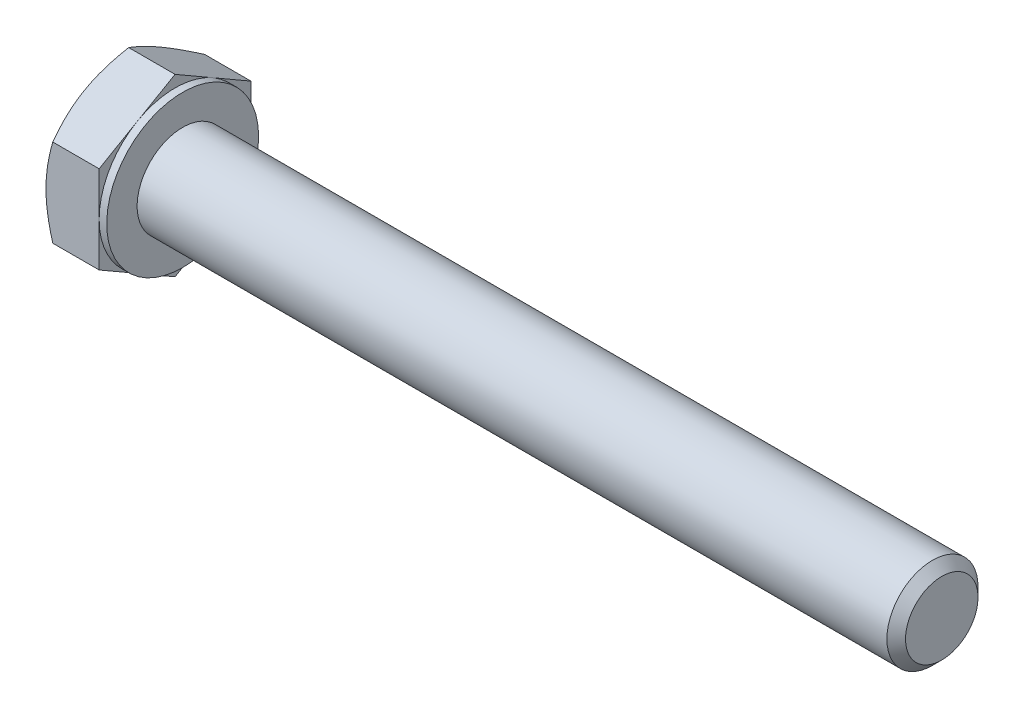
ISO-10303-21;
HEADER;
FILE_DESCRIPTION(('STEP AP214'),'2;1');
FILE_NAME('part.step','',(''),(''),'','','');
FILE_SCHEMA(('AUTOMOTIVE_DESIGN { 1 0 10303 214 1 1 1 1 }'));
ENDSEC;
DATA;
#1=APPLICATION_CONTEXT('core data for automotive mechanical design processes');
#2=APPLICATION_PROTOCOL_DEFINITION('international standard','automotive_design',2000,#1);
#3=PRODUCT_CONTEXT('',#1,'mechanical');
#4=PRODUCT('Part','Part','',(#3));
#5=PRODUCT_RELATED_PRODUCT_CATEGORY('part','',(#4));
#6=PRODUCT_DEFINITION_FORMATION('','',#4);
#7=PRODUCT_DEFINITION_CONTEXT('part definition',#1,'design');
#8=PRODUCT_DEFINITION('design','',#6,#7);
#9=PRODUCT_DEFINITION_SHAPE('','',#8);
#10=(LENGTH_UNIT() NAMED_UNIT(*) SI_UNIT(.MILLI.,.METRE.));
#11=(NAMED_UNIT(*) PLANE_ANGLE_UNIT() SI_UNIT($,.RADIAN.));
#12=(NAMED_UNIT(*) SI_UNIT($,.STERADIAN.) SOLID_ANGLE_UNIT());
#13=UNCERTAINTY_MEASURE_WITH_UNIT(LENGTH_MEASURE(1.E-05),#10,'distance_accuracy_value','');
#14=(GEOMETRIC_REPRESENTATION_CONTEXT(3) GLOBAL_UNCERTAINTY_ASSIGNED_CONTEXT((#13)) GLOBAL_UNIT_ASSIGNED_CONTEXT((#10,
#11,#12)) REPRESENTATION_CONTEXT('',''));
#15=CARTESIAN_POINT('',(0.,0.,0.));
#16=DIRECTION('',(0.,0.,1.));
#17=DIRECTION('',(1.,0.,0.));
#18=AXIS2_PLACEMENT_3D('',#15,#16,#17);
#19=CARTESIAN_POINT('',(0.,4.,0.));
#20=DIRECTION('',(1.,0.,0.));
#21=DIRECTION('',(0.,1.,0.));
#22=AXIS2_PLACEMENT_3D('',#19,#20,#21);
#23=PLANE('',#22);
#24=CARTESIAN_POINT('',(0.,0.,0.));
#25=DIRECTION('',(1.,0.,0.));
#26=DIRECTION('',(0.,1.,0.));
#27=AXIS2_PLACEMENT_3D('',#24,#25,#26);
#28=CIRCLE('',#27,3.);
#29=CARTESIAN_POINT('',(0.,-3.,0.));
#30=VERTEX_POINT('',#29);
#31=EDGE_CURVE('E68',#30,#30,#28,.T.);
#32=ORIENTED_EDGE('',*,*,#31,.F.);
#33=EDGE_LOOP('',(#32));
#34=FACE_BOUND('',#33,.T.);
#35=CARTESIAN_POINT('',(0.,0.,0.));
#36=DIRECTION('',(1.,0.,0.));
#37=DIRECTION('',(0.,1.,0.));
#38=AXIS2_PLACEMENT_3D('',#35,#36,#37);
#39=CIRCLE('',#38,5.);
#40=CARTESIAN_POINT('',(0.,-5.,0.));
#41=VERTEX_POINT('',#40);
#42=EDGE_CURVE('E27',#41,#41,#39,.T.);
#43=ORIENTED_EDGE('',*,*,#42,.T.);
#44=EDGE_LOOP('',(#43));
#45=FACE_BOUND('',#44,.T.);
#46=ADVANCED_FACE('F17',(#34,#45),#23,.T.);
#47=CARTESIAN_POINT('',(-0.250049999999993,0.,0.));
#48=DIRECTION('',(1.,0.,0.));
#49=DIRECTION('',(0.,1.,0.));
#50=AXIS2_PLACEMENT_3D('',#47,#48,#49);
#51=CYLINDRICAL_SURFACE('',#50,5.);
#52=ORIENTED_EDGE('',*,*,#42,.F.);
#53=DIRECTION('',(-1.,0.,0.));
#54=VECTOR('',#53,1.);
#55=CARTESIAN_POINT('',(-0.250049999999993,-5.,0.));
#56=LINE('',#55,#54);
#57=CARTESIAN_POINT('',(-0.5001,-5.,0.));
#58=VERTEX_POINT('',#57);
#59=EDGE_CURVE('E11',#41,#58,#56,.T.);
#60=ORIENTED_EDGE('',*,*,#59,.T.);
#61=CARTESIAN_POINT('',(-0.500099999999994,0.,0.));
#62=DIRECTION('',(1.,0.,0.));
#63=DIRECTION('',(0.,1.,0.));
#64=AXIS2_PLACEMENT_3D('',#61,#62,#63);
#65=CIRCLE('',#64,5.);
#66=CARTESIAN_POINT('',(-0.500099999999994,-4.33012701892219,-2.5));
#67=VERTEX_POINT('',#66);
#68=EDGE_CURVE('E368',#58,#67,#65,.T.);
#69=ORIENTED_EDGE('',*,*,#68,.T.);
#70=CARTESIAN_POINT('',(-0.500099999999994,0.,0.));
#71=DIRECTION('',(1.,0.,0.));
#72=DIRECTION('',(0.,1.,0.));
#73=AXIS2_PLACEMENT_3D('',#70,#71,#72);
#74=CIRCLE('',#73,5.);
#75=CARTESIAN_POINT('',(-0.500099999999994,0.,-5.));
#76=VERTEX_POINT('',#75);
#77=EDGE_CURVE('E363',#67,#76,#74,.T.);
#78=ORIENTED_EDGE('',*,*,#77,.T.);
#79=CARTESIAN_POINT('',(-0.500099999999994,0.,0.));
#80=DIRECTION('',(1.,0.,0.));
#81=DIRECTION('',(0.,1.,0.));
#82=AXIS2_PLACEMENT_3D('',#79,#80,#81);
#83=CIRCLE('',#82,5.);
#84=CARTESIAN_POINT('',(-0.5001,4.33012701892219,-2.5));
#85=VERTEX_POINT('',#84);
#86=EDGE_CURVE('E358',#76,#85,#83,.T.);
#87=ORIENTED_EDGE('',*,*,#86,.T.);
#88=CARTESIAN_POINT('',(-0.500099999999994,0.,0.));
#89=DIRECTION('',(1.,0.,0.));
#90=DIRECTION('',(0.,1.,0.));
#91=AXIS2_PLACEMENT_3D('',#88,#89,#90);
#92=CIRCLE('',#91,5.);
#93=CARTESIAN_POINT('',(-0.5001,4.33012701892219,2.5));
#94=VERTEX_POINT('',#93);
#95=EDGE_CURVE('E300',#85,#94,#92,.T.);
#96=ORIENTED_EDGE('',*,*,#95,.T.);
#97=CARTESIAN_POINT('',(-0.500099999999994,0.,0.));
#98=DIRECTION('',(1.,0.,0.));
#99=DIRECTION('',(0.,1.,0.));
#100=AXIS2_PLACEMENT_3D('',#97,#98,#99);
#101=CIRCLE('',#100,5.);
#102=CARTESIAN_POINT('',(-0.500099999999994,0.,5.));
#103=VERTEX_POINT('',#102);
#104=EDGE_CURVE('E301',#94,#103,#101,.T.);
#105=ORIENTED_EDGE('',*,*,#104,.T.);
#106=CARTESIAN_POINT('',(-0.500099999999994,0.,0.));
#107=DIRECTION('',(1.,0.,0.));
#108=DIRECTION('',(0.,1.,0.));
#109=AXIS2_PLACEMENT_3D('',#106,#107,#108);
#110=CIRCLE('',#109,5.);
#111=CARTESIAN_POINT('',(-0.500099999999994,-4.33012701892219,2.5));
#112=VERTEX_POINT('',#111);
#113=EDGE_CURVE('E372',#103,#112,#110,.T.);
#114=ORIENTED_EDGE('',*,*,#113,.T.);
#115=CARTESIAN_POINT('',(-0.500099999999994,0.,0.));
#116=DIRECTION('',(1.,0.,0.));
#117=DIRECTION('',(0.,1.,0.));
#118=AXIS2_PLACEMENT_3D('',#115,#116,#117);
#119=CIRCLE('',#118,5.);
#120=EDGE_CURVE('E229',#112,#58,#119,.T.);
#121=ORIENTED_EDGE('',*,*,#120,.T.);
#122=ORIENTED_EDGE('',*,*,#59,.F.);
#123=EDGE_LOOP('',(#52,#60,#69,#78,#87,#96,#105,#114,#121,#122));
#124=FACE_BOUND('',#123,.T.);
#125=ADVANCED_FACE('F457',(#124),#51,.T.);
#126=CARTESIAN_POINT('',(-4.0001,0.,0.));
#127=DIRECTION('',(1.,0.,0.));
#128=DIRECTION('',(0.,1.,0.));
#129=AXIS2_PLACEMENT_3D('',#126,#127,#128);
#130=PLANE('',#129);
#131=CARTESIAN_POINT('',(-4.0001,0.,0.));
#132=DIRECTION('',(-1.,0.,0.));
#133=DIRECTION('',(0.,1.,0.));
#134=AXIS2_PLACEMENT_3D('',#131,#132,#133);
#135=CIRCLE('',#134,5.);
#136=CARTESIAN_POINT('',(-4.0001,0.,5.));
#137=VERTEX_POINT('',#136);
#138=CARTESIAN_POINT('',(-4.0001,4.33012701892219,2.5));
#139=VERTEX_POINT('',#138);
#140=EDGE_CURVE('E278',#137,#139,#135,.T.);
#141=ORIENTED_EDGE('',*,*,#140,.T.);
#142=CARTESIAN_POINT('',(-4.0001,0.,0.));
#143=DIRECTION('',(-1.,0.,0.));
#144=DIRECTION('',(0.,1.,0.));
#145=AXIS2_PLACEMENT_3D('',#142,#143,#144);
#146=CIRCLE('',#145,5.);
#147=CARTESIAN_POINT('',(-4.0001,4.33012701892219,-2.5));
#148=VERTEX_POINT('',#147);
#149=EDGE_CURVE('E195',#139,#148,#146,.T.);
#150=ORIENTED_EDGE('',*,*,#149,.T.);
#151=CARTESIAN_POINT('',(-4.0001,0.,0.));
#152=DIRECTION('',(-1.,0.,0.));
#153=DIRECTION('',(0.,1.,0.));
#154=AXIS2_PLACEMENT_3D('',#151,#152,#153);
#155=CIRCLE('',#154,5.);
#156=CARTESIAN_POINT('',(-4.0001,0.,-5.));
#157=VERTEX_POINT('',#156);
#158=EDGE_CURVE('E191',#148,#157,#155,.T.);
#159=ORIENTED_EDGE('',*,*,#158,.T.);
#160=CARTESIAN_POINT('',(-4.0001,0.,0.));
#161=DIRECTION('',(-1.,0.,0.));
#162=DIRECTION('',(0.,1.,0.));
#163=AXIS2_PLACEMENT_3D('',#160,#161,#162);
#164=CIRCLE('',#163,5.);
#165=CARTESIAN_POINT('',(-4.0001,-4.33012701892219,-2.5));
#166=VERTEX_POINT('',#165);
#167=EDGE_CURVE('E164',#157,#166,#164,.T.);
#168=ORIENTED_EDGE('',*,*,#167,.T.);
#169=CARTESIAN_POINT('',(-4.0001,0.,0.));
#170=DIRECTION('',(-1.,0.,0.));
#171=DIRECTION('',(0.,1.,0.));
#172=AXIS2_PLACEMENT_3D('',#169,#170,#171);
#173=CIRCLE('',#172,5.);
#174=CARTESIAN_POINT('',(-4.0001,-4.33012701892219,2.5));
#175=VERTEX_POINT('',#174);
#176=EDGE_CURVE('E203',#166,#175,#173,.T.);
#177=ORIENTED_EDGE('',*,*,#176,.T.);
#178=CARTESIAN_POINT('',(-4.0001,0.,0.));
#179=DIRECTION('',(-1.,0.,0.));
#180=DIRECTION('',(0.,1.,0.));
#181=AXIS2_PLACEMENT_3D('',#178,#179,#180);
#182=CIRCLE('',#181,5.);
#183=EDGE_CURVE('E241',#175,#137,#182,.T.);
#184=ORIENTED_EDGE('',*,*,#183,.T.);
#185=EDGE_LOOP('',(#141,#150,#159,#168,#177,#184));
#186=FACE_BOUND('',#185,.T.);
#187=ADVANCED_FACE('F193',(#186),#130,.F.);
#188=CARTESIAN_POINT('',(-0.500099999999993,-5.77350269189625,0.));
#189=DIRECTION('',(0.,-0.866025403784439,-0.5));
#190=DIRECTION('',(0.,0.5,-0.866025403784439));
#191=AXIS2_PLACEMENT_3D('',#188,#189,#190);
#192=PLANE('',#191);
#193=CARTESIAN_POINT('',(-4.0001,-4.33012701892219,-2.5));
#194=CARTESIAN_POINT('',(-4.00010000000001,-3.66025403784439,-3.66025403784438));
#195=CARTESIAN_POINT('',(-3.55351801261482,-2.88675134594814,-5.));
#196=(BOUNDED_CURVE() B_SPLINE_CURVE(2,(#193,#194,#195),.UNSPECIFIED.,.F.,
.F.) B_SPLINE_CURVE_WITH_KNOTS((3,3),(0.292854859387618,0.585709718775236),
.UNSPECIFIED.) CURVE() GEOMETRIC_REPRESENTATION_ITEM() RATIONAL_B_SPLINE_CURVE((1.,
1.03795484930205,1.)) REPRESENTATION_ITEM(''));
#197=CARTESIAN_POINT('',(-3.55351801261482,-2.88675134594814,-5.));
#198=VERTEX_POINT('',#197);
#199=EDGE_CURVE('E169',#166,#198,#196,.T.);
#200=ORIENTED_EDGE('',*,*,#199,.T.);
#201=DIRECTION('',(-1.,0.,0.));
#202=VECTOR('',#201,1.);
#203=CARTESIAN_POINT('',(-0.500099999999993,-2.88675134594812,-5.));
#204=LINE('',#203,#202);
#205=CARTESIAN_POINT('',(-0.500099999999993,-2.88675134594812,-5.));
#206=VERTEX_POINT('',#205);
#207=EDGE_CURVE('E185',#206,#198,#204,.T.);
#208=ORIENTED_EDGE('',*,*,#207,.F.);
#209=DIRECTION('',(0.,0.5,-0.866025403784439));
#210=VECTOR('',#209,1.);
#211=CARTESIAN_POINT('',(-0.500099999999993,-5.77350269189625,0.));
#212=LINE('',#211,#210);
#213=EDGE_CURVE('E375',#67,#206,#212,.T.);
#214=ORIENTED_EDGE('',*,*,#213,.F.);
#215=DIRECTION('',(0.,0.5,-0.866025403784439));
#216=VECTOR('',#215,1.);
#217=CARTESIAN_POINT('',(-0.500099999999993,-5.77350269189625,0.));
#218=LINE('',#217,#216);
#219=CARTESIAN_POINT('',(-0.500099999999993,-5.77350269189625,0.));
#220=VERTEX_POINT('',#219);
#221=EDGE_CURVE('E228',#220,#67,#218,.T.);
#222=ORIENTED_EDGE('',*,*,#221,.F.);
#223=DIRECTION('',(-1.,0.,0.));
#224=VECTOR('',#223,1.);
#225=CARTESIAN_POINT('',(-0.500099999999993,-5.77350269189625,0.));
#226=LINE('',#225,#224);
#227=CARTESIAN_POINT('',(-3.55351801261482,-5.77350269189624,0.));
#228=VERTEX_POINT('',#227);
#229=EDGE_CURVE('E307',#220,#228,#226,.T.);
#230=ORIENTED_EDGE('',*,*,#229,.T.);
#231=CARTESIAN_POINT('',(-3.55351801261482,-5.77350269189624,0.));
#232=CARTESIAN_POINT('',(-4.00010000000001,-4.99999999999999,-1.33974596215562));
#233=CARTESIAN_POINT('',(-4.0001,-4.33012701892219,-2.5));
#234=(BOUNDED_CURVE() B_SPLINE_CURVE(2,(#231,#232,#233),.UNSPECIFIED.,.F.,
.F.) B_SPLINE_CURVE_WITH_KNOTS((3,3),(0.,0.292854859387618),
.UNSPECIFIED.) CURVE() GEOMETRIC_REPRESENTATION_ITEM() RATIONAL_B_SPLINE_CURVE((1.,
1.03795484930206,1.)) REPRESENTATION_ITEM(''));
#235=EDGE_CURVE('E260',#228,#166,#234,.T.);
#236=ORIENTED_EDGE('',*,*,#235,.T.);
#237=EDGE_LOOP('',(#200,#208,#214,#222,#230,#236));
#238=FACE_BOUND('',#237,.T.);
#239=ADVANCED_FACE('F452',(#238),#192,.T.);
#240=CARTESIAN_POINT('',(-0.500099999999993,-2.88675134594813,5.));
#241=DIRECTION('',(0.,-0.866025403784439,0.5));
#242=DIRECTION('',(-1.,0.,0.));
#243=AXIS2_PLACEMENT_3D('',#240,#241,#242);
#244=PLANE('',#243);
#245=CARTESIAN_POINT('',(-4.0001,-4.33012701892219,2.5));
#246=CARTESIAN_POINT('',(-4.00010000000001,-4.99999999999999,1.33974596215562));
#247=CARTESIAN_POINT('',(-3.55351801261482,-5.77350269189624,0.));
#248=(BOUNDED_CURVE() B_SPLINE_CURVE(2,(#245,#246,#247),.UNSPECIFIED.,.F.,
.F.) B_SPLINE_CURVE_WITH_KNOTS((3,3),(0.292854859387618,0.585709718775236),
.UNSPECIFIED.) CURVE() GEOMETRIC_REPRESENTATION_ITEM() RATIONAL_B_SPLINE_CURVE((1.,
1.03795484930203,1.)) REPRESENTATION_ITEM(''));
#249=EDGE_CURVE('E209',#175,#228,#248,.T.);
#250=ORIENTED_EDGE('',*,*,#249,.T.);
#251=ORIENTED_EDGE('',*,*,#229,.F.);
#252=DIRECTION('',(0.,-0.5,-0.866025403784439));
#253=VECTOR('',#252,1.);
#254=CARTESIAN_POINT('',(-0.500099999999993,-2.88675134594813,5.));
#255=LINE('',#254,#253);
#256=EDGE_CURVE('E225',#112,#220,#255,.T.);
#257=ORIENTED_EDGE('',*,*,#256,.F.);
#258=DIRECTION('',(0.,-0.5,-0.866025403784439));
#259=VECTOR('',#258,1.);
#260=CARTESIAN_POINT('',(-0.500099999999993,-2.88675134594813,5.));
#261=LINE('',#260,#259);
#262=CARTESIAN_POINT('',(-0.500099999999993,-2.88675134594813,5.));
#263=VERTEX_POINT('',#262);
#264=EDGE_CURVE('E401',#263,#112,#261,.T.);
#265=ORIENTED_EDGE('',*,*,#264,.F.);
#266=DIRECTION('',(-1.,0.,0.));
#267=VECTOR('',#266,1.);
#268=CARTESIAN_POINT('',(-0.500099999999993,-2.88675134594813,5.));
#269=LINE('',#268,#267);
#270=CARTESIAN_POINT('',(-3.55351801261482,-2.8867513459481,5.));
#271=VERTEX_POINT('',#270);
#272=EDGE_CURVE('E50',#263,#271,#269,.T.);
#273=ORIENTED_EDGE('',*,*,#272,.T.);
#274=CARTESIAN_POINT('',(-3.55351801261482,-2.88675134594814,5.));
#275=CARTESIAN_POINT('',(-4.00010000000001,-3.66025403784439,3.66025403784437));
#276=CARTESIAN_POINT('',(-4.0001,-4.33012701892219,2.5));
#277=(BOUNDED_CURVE() B_SPLINE_CURVE(2,(#274,#275,#276),.UNSPECIFIED.,.F.,
.F.) B_SPLINE_CURVE_WITH_KNOTS((3,3),(0.,0.292854859387618),
.UNSPECIFIED.) CURVE() GEOMETRIC_REPRESENTATION_ITEM() RATIONAL_B_SPLINE_CURVE((1.,
1.03795484930204,1.)) REPRESENTATION_ITEM(''));
#278=EDGE_CURVE('E242',#271,#175,#277,.T.);
#279=ORIENTED_EDGE('',*,*,#278,.T.);
#280=EDGE_LOOP('',(#250,#251,#257,#265,#273,#279));
#281=FACE_BOUND('',#280,.T.);
#282=ADVANCED_FACE('F446',(#281),#244,.T.);
#283=CARTESIAN_POINT('',(-0.500099999999994,2.88675134594812,5.));
#284=DIRECTION('',(0.,0.,1.));
#285=DIRECTION('',(0.,-1.,0.));
#286=AXIS2_PLACEMENT_3D('',#283,#284,#285);
#287=PLANE('',#286);
#288=CARTESIAN_POINT('',(-4.0001,0.,5.));
#289=CARTESIAN_POINT('',(-4.00010000000001,-1.3397459621556,4.99999999999999));
#290=CARTESIAN_POINT('',(-3.55351801261482,-2.8867513459481,5.));
#291=(BOUNDED_CURVE() B_SPLINE_CURVE(2,(#288,#289,#290),.UNSPECIFIED.,.F.,
.F.) B_SPLINE_CURVE_WITH_KNOTS((3,3),(0.292854859387618,0.585709718775236),
.UNSPECIFIED.) CURVE() GEOMETRIC_REPRESENTATION_ITEM() RATIONAL_B_SPLINE_CURVE((1.,
1.03795484930204,1.)) REPRESENTATION_ITEM(''));
#292=EDGE_CURVE('E233',#137,#271,#291,.T.);
#293=ORIENTED_EDGE('',*,*,#292,.T.);
#294=ORIENTED_EDGE('',*,*,#272,.F.);
#295=DIRECTION('',(0.,-1.,0.));
#296=VECTOR('',#295,1.);
#297=CARTESIAN_POINT('',(-0.500099999999994,2.88675134594812,5.));
#298=LINE('',#297,#296);
#299=EDGE_CURVE('E407',#103,#263,#298,.T.);
#300=ORIENTED_EDGE('',*,*,#299,.F.);
#301=DIRECTION('',(0.,-1.,0.));
#302=VECTOR('',#301,1.);
#303=CARTESIAN_POINT('',(-0.500099999999994,2.88675134594812,5.));
#304=LINE('',#303,#302);
#305=CARTESIAN_POINT('',(-0.500099999999994,2.88675134594812,5.));
#306=VERTEX_POINT('',#305);
#307=EDGE_CURVE('E297',#306,#103,#304,.T.);
#308=ORIENTED_EDGE('',*,*,#307,.F.);
#309=DIRECTION('',(-1.,0.,0.));
#310=VECTOR('',#309,1.);
#311=CARTESIAN_POINT('',(-0.500099999999994,2.88675134594812,5.));
#312=LINE('',#311,#310);
#313=CARTESIAN_POINT('',(-3.55351801261482,2.88675134594809,5.));
#314=VERTEX_POINT('',#313);
#315=EDGE_CURVE('E223',#306,#314,#312,.T.);
#316=ORIENTED_EDGE('',*,*,#315,.T.);
#317=CARTESIAN_POINT('',(-3.55351801261482,2.88675134594809,5.));
#318=CARTESIAN_POINT('',(-4.00010000000001,1.33974596215559,5.));
#319=CARTESIAN_POINT('',(-4.0001,0.,5.));
#320=(BOUNDED_CURVE() B_SPLINE_CURVE(2,(#317,#318,#319),.UNSPECIFIED.,.F.,
.F.) B_SPLINE_CURVE_WITH_KNOTS((3,3),(0.,0.292854859387618),
.UNSPECIFIED.) CURVE() GEOMETRIC_REPRESENTATION_ITEM() RATIONAL_B_SPLINE_CURVE((1.,
1.03795484930205,1.)) REPRESENTATION_ITEM(''));
#321=EDGE_CURVE('E251',#314,#137,#320,.T.);
#322=ORIENTED_EDGE('',*,*,#321,.T.);
#323=EDGE_LOOP('',(#293,#294,#300,#308,#316,#322));
#324=FACE_BOUND('',#323,.T.);
#325=ADVANCED_FACE('F500',(#324),#287,.T.);
#326=CARTESIAN_POINT('',(-0.500099999999994,0.,0.));
#327=DIRECTION('',(1.,0.,0.));
#328=DIRECTION('',(0.,1.,0.));
#329=AXIS2_PLACEMENT_3D('',#326,#327,#328);
#330=PLANE('',#329);
#331=ORIENTED_EDGE('',*,*,#77,.F.);
#332=ORIENTED_EDGE('',*,*,#213,.T.);
#333=DIRECTION('',(0.,1.,0.));
#334=VECTOR('',#333,1.);
#335=CARTESIAN_POINT('',(-0.500099999999993,-2.88675134594812,-5.));
#336=LINE('',#335,#334);
#337=EDGE_CURVE('E313',#206,#76,#336,.T.);
#338=ORIENTED_EDGE('',*,*,#337,.T.);
#339=EDGE_LOOP('',(#331,#332,#338));
#340=FACE_BOUND('',#339,.T.);
#341=ADVANCED_FACE('F477',(#340),#330,.T.);
#342=CARTESIAN_POINT('',(-0.500099999999994,0.,0.));
#343=DIRECTION('',(1.,0.,0.));
#344=DIRECTION('',(0.,1.,0.));
#345=AXIS2_PLACEMENT_3D('',#342,#343,#344);
#346=PLANE('',#345);
#347=ORIENTED_EDGE('',*,*,#86,.F.);
#348=DIRECTION('',(0.,1.,0.));
#349=VECTOR('',#348,1.);
#350=CARTESIAN_POINT('',(-0.500099999999993,-2.88675134594812,-5.));
#351=LINE('',#350,#349);
#352=CARTESIAN_POINT('',(-0.500099999999994,2.88675134594813,-5.));
#353=VERTEX_POINT('',#352);
#354=EDGE_CURVE('E319',#76,#353,#351,.T.);
#355=ORIENTED_EDGE('',*,*,#354,.T.);
#356=DIRECTION('',(0.,0.5,0.866025403784439));
#357=VECTOR('',#356,1.);
#358=CARTESIAN_POINT('',(-0.500099999999994,2.88675134594813,-5.));
#359=LINE('',#358,#357);
#360=EDGE_CURVE('E216',#353,#85,#359,.T.);
#361=ORIENTED_EDGE('',*,*,#360,.T.);
#362=EDGE_LOOP('',(#347,#355,#361));
#363=FACE_BOUND('',#362,.T.);
#364=ADVANCED_FACE('F473',(#363),#346,.T.);
#365=CARTESIAN_POINT('',(-0.500099999999994,0.,0.));
#366=DIRECTION('',(1.,0.,0.));
#367=DIRECTION('',(0.,1.,0.));
#368=AXIS2_PLACEMENT_3D('',#365,#366,#367);
#369=PLANE('',#368);
#370=ORIENTED_EDGE('',*,*,#95,.F.);
#371=DIRECTION('',(0.,0.5,0.866025403784439));
#372=VECTOR('',#371,1.);
#373=CARTESIAN_POINT('',(-0.500099999999994,2.88675134594813,-5.));
#374=LINE('',#373,#372);
#375=CARTESIAN_POINT('',(-0.500099999999994,5.77350269189625,0.));
#376=VERTEX_POINT('',#375);
#377=EDGE_CURVE('E224',#85,#376,#374,.T.);
#378=ORIENTED_EDGE('',*,*,#377,.T.);
#379=DIRECTION('',(0.,-0.5,0.866025403784438));
#380=VECTOR('',#379,1.);
#381=CARTESIAN_POINT('',(-0.500099999999994,5.77350269189625,0.));
#382=LINE('',#381,#380);
#383=EDGE_CURVE('E293',#376,#94,#382,.T.);
#384=ORIENTED_EDGE('',*,*,#383,.T.);
#385=EDGE_LOOP('',(#370,#378,#384));
#386=FACE_BOUND('',#385,.T.);
#387=ADVANCED_FACE('F476',(#386),#369,.T.);
#388=CARTESIAN_POINT('',(-0.500099999999994,0.,0.));
#389=DIRECTION('',(1.,0.,0.));
#390=DIRECTION('',(0.,1.,0.));
#391=AXIS2_PLACEMENT_3D('',#388,#389,#390);
#392=PLANE('',#391);
#393=ORIENTED_EDGE('',*,*,#104,.F.);
#394=DIRECTION('',(0.,-0.5,0.866025403784438));
#395=VECTOR('',#394,1.);
#396=CARTESIAN_POINT('',(-0.500099999999994,5.77350269189625,0.));
#397=LINE('',#396,#395);
#398=EDGE_CURVE('E286',#94,#306,#397,.T.);
#399=ORIENTED_EDGE('',*,*,#398,.T.);
#400=ORIENTED_EDGE('',*,*,#307,.T.);
#401=EDGE_LOOP('',(#393,#399,#400));
#402=FACE_BOUND('',#401,.T.);
#403=ADVANCED_FACE('F19',(#402),#392,.T.);
#404=CARTESIAN_POINT('',(-0.500099999999994,0.,0.));
#405=DIRECTION('',(1.,0.,0.));
#406=DIRECTION('',(0.,1.,0.));
#407=AXIS2_PLACEMENT_3D('',#404,#405,#406);
#408=PLANE('',#407);
#409=ORIENTED_EDGE('',*,*,#113,.F.);
#410=ORIENTED_EDGE('',*,*,#299,.T.);
#411=ORIENTED_EDGE('',*,*,#264,.T.);
#412=EDGE_LOOP('',(#409,#410,#411));
#413=FACE_BOUND('',#412,.T.);
#414=ADVANCED_FACE('F511',(#413),#408,.T.);
#415=CARTESIAN_POINT('',(-0.500099999999994,0.,0.));
#416=DIRECTION('',(1.,0.,0.));
#417=DIRECTION('',(0.,1.,0.));
#418=AXIS2_PLACEMENT_3D('',#415,#416,#417);
#419=PLANE('',#418);
#420=ORIENTED_EDGE('',*,*,#120,.F.);
#421=ORIENTED_EDGE('',*,*,#256,.T.);
#422=ORIENTED_EDGE('',*,*,#221,.T.);
#423=ORIENTED_EDGE('',*,*,#68,.F.);
#424=EDGE_LOOP('',(#420,#421,#422,#423));
#425=FACE_BOUND('',#424,.T.);
#426=ADVANCED_FACE('F456',(#425),#419,.T.);
#427=CARTESIAN_POINT('',(-0.500099999999994,5.77350269189625,0.));
#428=DIRECTION('',(0.,0.866025403784438,0.5));
#429=DIRECTION('',(1.,0.,0.));
#430=AXIS2_PLACEMENT_3D('',#427,#428,#429);
#431=PLANE('',#430);
#432=CARTESIAN_POINT('',(-3.55351801261482,5.77350269189624,0.));
#433=CARTESIAN_POINT('',(-4.00010000000001,4.99999999999999,1.33974596215563));
#434=CARTESIAN_POINT('',(-4.0001,4.33012701892219,2.5));
#435=(BOUNDED_CURVE() B_SPLINE_CURVE(2,(#432,#433,#434),.UNSPECIFIED.,.F.,
.F.) B_SPLINE_CURVE_WITH_KNOTS((3,3),(0.,0.292854859387618),
.UNSPECIFIED.) CURVE() GEOMETRIC_REPRESENTATION_ITEM() RATIONAL_B_SPLINE_CURVE((1.,
1.03795484930203,1.)) REPRESENTATION_ITEM(''));
#436=CARTESIAN_POINT('',(-3.55351801261482,5.77350269189624,0.));
#437=VERTEX_POINT('',#436);
#438=EDGE_CURVE('E252',#437,#139,#435,.T.);
#439=ORIENTED_EDGE('',*,*,#438,.T.);
#440=CARTESIAN_POINT('',(-4.0001,4.33012701892219,2.5));
#441=CARTESIAN_POINT('',(-4.00010000000001,3.66025403784439,3.66025403784437));
#442=CARTESIAN_POINT('',(-3.55351801261482,2.88675134594814,5.));
#443=(BOUNDED_CURVE() B_SPLINE_CURVE(2,(#440,#441,#442),.UNSPECIFIED.,.F.,
.F.) B_SPLINE_CURVE_WITH_KNOTS((3,3),(0.292854859387618,0.585709718775236),
.UNSPECIFIED.) CURVE() GEOMETRIC_REPRESENTATION_ITEM() RATIONAL_B_SPLINE_CURVE((1.,
1.03795484930205,1.)) REPRESENTATION_ITEM(''));
#444=EDGE_CURVE('E269',#139,#314,#443,.T.);
#445=ORIENTED_EDGE('',*,*,#444,.T.);
#446=ORIENTED_EDGE('',*,*,#315,.F.);
#447=ORIENTED_EDGE('',*,*,#398,.F.);
#448=ORIENTED_EDGE('',*,*,#383,.F.);
#449=DIRECTION('',(-1.,0.,0.));
#450=VECTOR('',#449,1.);
#451=CARTESIAN_POINT('',(-0.500099999999994,5.77350269189625,0.));
#452=LINE('',#451,#450);
#453=EDGE_CURVE('E21',#376,#437,#452,.T.);
#454=ORIENTED_EDGE('',*,*,#453,.T.);
#455=EDGE_LOOP('',(#439,#445,#446,#447,#448,#454));
#456=FACE_BOUND('',#455,.T.);
#457=ADVANCED_FACE('F491',(#456),#431,.T.);
#458=CARTESIAN_POINT('',(-0.500099999999994,2.88675134594813,-5.));
#459=DIRECTION('',(0.,0.866025403784439,-0.5));
#460=DIRECTION('',(-1.,0.,0.));
#461=AXIS2_PLACEMENT_3D('',#458,#459,#460);
#462=PLANE('',#461);
#463=CARTESIAN_POINT('',(-3.55351801261482,2.88675134594814,-5.));
#464=CARTESIAN_POINT('',(-4.00010000000001,3.66025403784439,-3.66025403784437));
#465=CARTESIAN_POINT('',(-4.0001,4.33012701892219,-2.5));
#466=(BOUNDED_CURVE() B_SPLINE_CURVE(2,(#463,#464,#465),.UNSPECIFIED.,.F.,
.F.) B_SPLINE_CURVE_WITH_KNOTS((3,3),(0.,0.292854859387618),
.UNSPECIFIED.) CURVE() GEOMETRIC_REPRESENTATION_ITEM() RATIONAL_B_SPLINE_CURVE((1.,
1.03795484930203,1.)) REPRESENTATION_ITEM(''));
#467=CARTESIAN_POINT('',(-3.55351801261482,2.8867513459481,-5.));
#468=VERTEX_POINT('',#467);
#469=EDGE_CURVE('E187',#468,#148,#466,.T.);
#470=ORIENTED_EDGE('',*,*,#469,.T.);
#471=CARTESIAN_POINT('',(-4.0001,4.33012701892219,-2.5));
#472=CARTESIAN_POINT('',(-4.00010000000001,4.99999999999999,-1.33974596215562));
#473=CARTESIAN_POINT('',(-3.55351801261482,5.77350269189624,0.));
#474=(BOUNDED_CURVE() B_SPLINE_CURVE(2,(#471,#472,#473),.UNSPECIFIED.,.F.,
.F.) B_SPLINE_CURVE_WITH_KNOTS((3,3),(0.292854859387618,0.585709718775236),
.UNSPECIFIED.) CURVE() GEOMETRIC_REPRESENTATION_ITEM() RATIONAL_B_SPLINE_CURVE((1.,
1.03795484930202,1.)) REPRESENTATION_ITEM(''));
#475=EDGE_CURVE('E304',#148,#437,#474,.T.);
#476=ORIENTED_EDGE('',*,*,#475,.T.);
#477=ORIENTED_EDGE('',*,*,#453,.F.);
#478=ORIENTED_EDGE('',*,*,#377,.F.);
#479=ORIENTED_EDGE('',*,*,#360,.F.);
#480=DIRECTION('',(-1.,0.,0.));
#481=VECTOR('',#480,1.);
#482=CARTESIAN_POINT('',(-0.500099999999994,2.88675134594813,-5.));
#483=LINE('',#482,#481);
#484=EDGE_CURVE('E174',#353,#468,#483,.T.);
#485=ORIENTED_EDGE('',*,*,#484,.T.);
#486=EDGE_LOOP('',(#470,#476,#477,#478,#479,#485));
#487=FACE_BOUND('',#486,.T.);
#488=ADVANCED_FACE('F488',(#487),#462,.T.);
#489=CARTESIAN_POINT('',(-0.500099999999993,-2.88675134594812,-5.));
#490=DIRECTION('',(0.,0.,-1.));
#491=DIRECTION('',(-1.,0.,0.));
#492=AXIS2_PLACEMENT_3D('',#489,#490,#491);
#493=PLANE('',#492);
#494=CARTESIAN_POINT('',(-3.55351801261482,-2.88675134594809,-5.));
#495=CARTESIAN_POINT('',(-4.00010000000001,-1.3397459621556,-5.));
#496=CARTESIAN_POINT('',(-4.0001,0.,-5.));
#497=(BOUNDED_CURVE() B_SPLINE_CURVE(2,(#494,#495,#496),.UNSPECIFIED.,.F.,
.F.) B_SPLINE_CURVE_WITH_KNOTS((3,3),(0.,0.292854859387618),
.UNSPECIFIED.) CURVE() GEOMETRIC_REPRESENTATION_ITEM() RATIONAL_B_SPLINE_CURVE((1.,
1.03795484930205,1.)) REPRESENTATION_ITEM(''));
#498=EDGE_CURVE('E167',#198,#157,#497,.T.);
#499=ORIENTED_EDGE('',*,*,#498,.T.);
#500=CARTESIAN_POINT('',(-4.0001,0.,-5.));
#501=CARTESIAN_POINT('',(-4.00010000000001,1.3397459621556,-5.));
#502=CARTESIAN_POINT('',(-3.55351801261482,2.8867513459481,-5.));
#503=(BOUNDED_CURVE() B_SPLINE_CURVE(2,(#500,#501,#502),.UNSPECIFIED.,.F.,
.F.) B_SPLINE_CURVE_WITH_KNOTS((3,3),(0.292854859387618,0.585709718775236),
.UNSPECIFIED.) CURVE() GEOMETRIC_REPRESENTATION_ITEM() RATIONAL_B_SPLINE_CURVE((1.,
1.03795484930204,1.)) REPRESENTATION_ITEM(''));
#504=EDGE_CURVE('E182',#157,#468,#503,.T.);
#505=ORIENTED_EDGE('',*,*,#504,.T.);
#506=ORIENTED_EDGE('',*,*,#484,.F.);
#507=ORIENTED_EDGE('',*,*,#354,.F.);
#508=ORIENTED_EDGE('',*,*,#337,.F.);
#509=ORIENTED_EDGE('',*,*,#207,.T.);
#510=EDGE_LOOP('',(#499,#505,#506,#507,#508,#509));
#511=FACE_BOUND('',#510,.T.);
#512=ADVANCED_FACE('F179',(#511),#493,.T.);
#513=CARTESIAN_POINT('',(-3.77680900630741,0.,0.));
#514=DIRECTION('',(1.,0.,0.));
#515=DIRECTION('',(0.,1.,0.));
#516=AXIS2_PLACEMENT_3D('',#513,#514,#515);
#517=CONICAL_SURFACE('',#516,5.38675134594812,1.0471975511966);
#518=ORIENTED_EDGE('',*,*,#498,.F.);
#519=ORIENTED_EDGE('',*,*,#199,.F.);
#520=ORIENTED_EDGE('',*,*,#167,.F.);
#521=EDGE_LOOP('',(#518,#519,#520));
#522=FACE_BOUND('',#521,.T.);
#523=ADVANCED_FACE('F166',(#522),#517,.T.);
#524=CARTESIAN_POINT('',(-3.77680900630741,0.,0.));
#525=DIRECTION('',(1.,0.,0.));
#526=DIRECTION('',(0.,1.,0.));
#527=AXIS2_PLACEMENT_3D('',#524,#525,#526);
#528=CONICAL_SURFACE('',#527,5.38675134594812,1.0471975511966);
#529=ORIENTED_EDGE('',*,*,#504,.F.);
#530=ORIENTED_EDGE('',*,*,#158,.F.);
#531=ORIENTED_EDGE('',*,*,#469,.F.);
#532=EDGE_LOOP('',(#529,#530,#531));
#533=FACE_BOUND('',#532,.T.);
#534=ADVANCED_FACE('F201',(#533),#528,.T.);
#535=CARTESIAN_POINT('',(-3.77680900630741,0.,0.));
#536=DIRECTION('',(1.,0.,0.));
#537=DIRECTION('',(0.,-1.,0.));
#538=AXIS2_PLACEMENT_3D('',#535,#536,#537);
#539=CONICAL_SURFACE('',#538,5.38675134594812,1.0471975511966);
#540=ORIENTED_EDGE('',*,*,#235,.F.);
#541=ORIENTED_EDGE('',*,*,#249,.F.);
#542=ORIENTED_EDGE('',*,*,#176,.F.);
#543=EDGE_LOOP('',(#540,#541,#542));
#544=FACE_BOUND('',#543,.T.);
#545=ADVANCED_FACE('F471',(#544),#539,.T.);
#546=CARTESIAN_POINT('',(-3.77680900630741,0.,0.));
#547=DIRECTION('',(1.,0.,0.));
#548=DIRECTION('',(0.,1.,0.));
#549=AXIS2_PLACEMENT_3D('',#546,#547,#548);
#550=CONICAL_SURFACE('',#549,5.38675134594812,1.0471975511966);
#551=ORIENTED_EDGE('',*,*,#475,.F.);
#552=ORIENTED_EDGE('',*,*,#149,.F.);
#553=ORIENTED_EDGE('',*,*,#438,.F.);
#554=EDGE_LOOP('',(#551,#552,#553));
#555=FACE_BOUND('',#554,.T.);
#556=ADVANCED_FACE('F507',(#555),#550,.T.);
#557=CARTESIAN_POINT('',(-3.77680900630741,0.,0.));
#558=DIRECTION('',(1.,0.,0.));
#559=DIRECTION('',(0.,1.,0.));
#560=AXIS2_PLACEMENT_3D('',#557,#558,#559);
#561=CONICAL_SURFACE('',#560,5.38675134594812,1.0471975511966);
#562=ORIENTED_EDGE('',*,*,#278,.F.);
#563=ORIENTED_EDGE('',*,*,#292,.F.);
#564=ORIENTED_EDGE('',*,*,#183,.F.);
#565=EDGE_LOOP('',(#562,#563,#564));
#566=FACE_BOUND('',#565,.T.);
#567=ADVANCED_FACE('F503',(#566),#561,.T.);
#568=CARTESIAN_POINT('',(-3.77680900630741,0.,0.));
#569=DIRECTION('',(1.,0.,0.));
#570=DIRECTION('',(0.,1.,0.));
#571=AXIS2_PLACEMENT_3D('',#568,#569,#570);
#572=CONICAL_SURFACE('',#571,5.38675134594812,1.0471975511966);
#573=ORIENTED_EDGE('',*,*,#444,.F.);
#574=ORIENTED_EDGE('',*,*,#140,.F.);
#575=ORIENTED_EDGE('',*,*,#321,.F.);
#576=EDGE_LOOP('',(#573,#574,#575));
#577=FACE_BOUND('',#576,.T.);
#578=ADVANCED_FACE('F506',(#577),#572,.T.);
#579=CARTESIAN_POINT('',(50.,1.5,0.));
#580=DIRECTION('',(1.,0.,0.));
#581=DIRECTION('',(0.,1.,0.));
#582=AXIS2_PLACEMENT_3D('',#579,#580,#581);
#583=PLANE('',#582);
#584=CARTESIAN_POINT('',(50.,0.,0.));
#585=DIRECTION('',(-1.,0.,0.));
#586=DIRECTION('',(0.,-1.,0.));
#587=AXIS2_PLACEMENT_3D('',#584,#585,#586);
#588=CIRCLE('',#587,2.38655);
#589=CARTESIAN_POINT('',(50.,2.38655,0.));
#590=VERTEX_POINT('',#589);
#591=EDGE_CURVE('E344',#590,#590,#588,.T.);
#592=ORIENTED_EDGE('',*,*,#591,.F.);
#593=EDGE_LOOP('',(#592));
#594=FACE_BOUND('',#593,.T.);
#595=ADVANCED_FACE('F494',(#594),#583,.T.);
#596=CARTESIAN_POINT('',(26.5,0.,0.));
#597=DIRECTION('',(1.,0.,0.));
#598=DIRECTION('',(0.,1.,0.));
#599=AXIS2_PLACEMENT_3D('',#596,#597,#598);
#600=CYLINDRICAL_SURFACE('',#599,3.);
#601=CARTESIAN_POINT('',(49.38645,0.,0.));
#602=DIRECTION('',(1.,0.,0.));
#603=DIRECTION('',(0.,-1.,0.));
#604=AXIS2_PLACEMENT_3D('',#601,#602,#603);
#605=CIRCLE('',#604,3.);
#606=CARTESIAN_POINT('',(49.38645,3.,0.));
#607=VERTEX_POINT('',#606);
#608=CARTESIAN_POINT('',(49.38645,-3.,0.));
#609=VERTEX_POINT('',#608);
#610=EDGE_CURVE('E343',#607,#609,#605,.T.);
#611=ORIENTED_EDGE('',*,*,#610,.F.);
#612=CARTESIAN_POINT('',(49.38645,0.,0.));
#613=DIRECTION('',(1.,0.,0.));
#614=DIRECTION('',(0.,-1.,0.));
#615=AXIS2_PLACEMENT_3D('',#612,#613,#614);
#616=CIRCLE('',#615,3.);
#617=EDGE_CURVE('E340',#609,#607,#616,.T.);
#618=ORIENTED_EDGE('',*,*,#617,.F.);
#619=DIRECTION('',(-1.,0.,0.));
#620=VECTOR('',#619,1.);
#621=CARTESIAN_POINT('',(26.5,-3.,0.));
#622=LINE('',#621,#620);
#623=EDGE_CURVE('E79',#609,#30,#622,.T.);
#624=ORIENTED_EDGE('',*,*,#623,.T.);
#625=ORIENTED_EDGE('',*,*,#31,.T.);
#626=ORIENTED_EDGE('',*,*,#623,.F.);
#627=EDGE_LOOP('',(#611,#618,#624,#625,#626));
#628=FACE_BOUND('',#627,.T.);
#629=ADVANCED_FACE('F482',(#628),#600,.T.);
#630=CARTESIAN_POINT('',(49.693225,0.,0.));
#631=DIRECTION('',(-1.,0.,0.));
#632=DIRECTION('',(0.,-1.,0.));
#633=AXIS2_PLACEMENT_3D('',#630,#631,#632);
#634=CONICAL_SURFACE('',#633,2.693275,0.785316663805125);
#635=ORIENTED_EDGE('',*,*,#591,.T.);
#636=DIRECTION('',(-0.707164407752513,0.707049149923849,0.));
#637=VECTOR('',#636,1.);
#638=CARTESIAN_POINT('',(49.693225,2.693275,0.));
#639=LINE('',#638,#637);
#640=EDGE_CURVE('E347',#590,#607,#639,.T.);
#641=ORIENTED_EDGE('',*,*,#640,.T.);
#642=ORIENTED_EDGE('',*,*,#610,.T.);
#643=ORIENTED_EDGE('',*,*,#617,.T.);
#644=ORIENTED_EDGE('',*,*,#640,.F.);
#645=EDGE_LOOP('',(#635,#641,#642,#643,#644));
#646=FACE_BOUND('',#645,.T.);
#647=ADVANCED_FACE('F432',(#646),#634,.T.);
#648=CLOSED_SHELL('',(#46,#125,#187,#239,#282,#325,#341,#364,#387,#403,#414,#426,#457,#488,#512,
#523,#534,#545,#556,#567,#578,#595,#629,#647));
#649=MANIFOLD_SOLID_BREP('B1',#648);
#650=ADVANCED_BREP_SHAPE_REPRESENTATION('',(#18,#649),#14);
#651=SHAPE_DEFINITION_REPRESENTATION(#9,#650);
ENDSEC;
END-ISO-10303-21;
